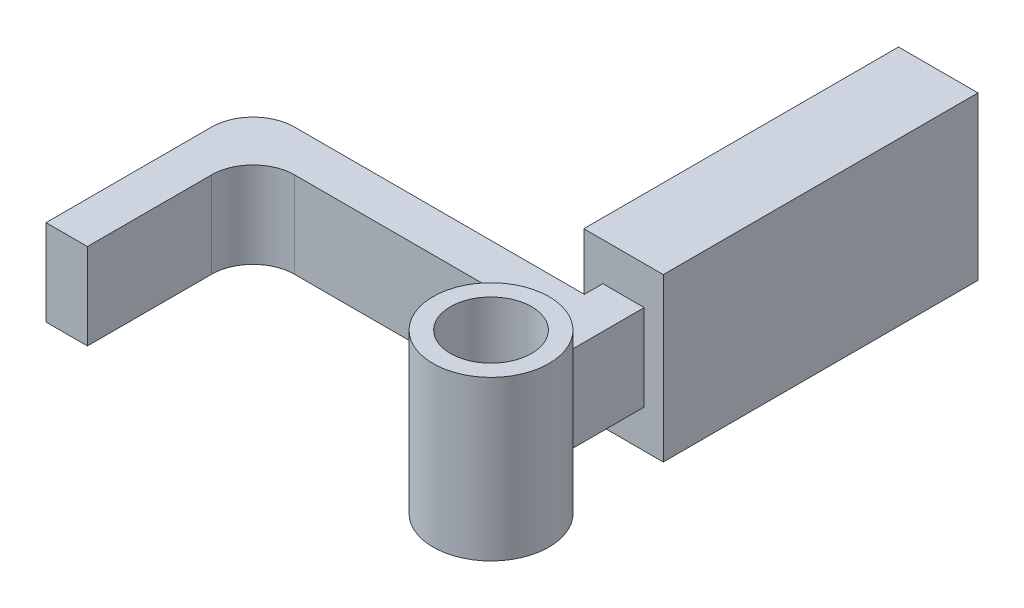
ISO-10303-21;
HEADER;
FILE_DESCRIPTION(('STEP AP214'),'2;1');
FILE_NAME('part.step','',(''),(''),'','','');
FILE_SCHEMA(('AUTOMOTIVE_DESIGN { 1 0 10303 214 1 1 1 1 }'));
ENDSEC;
DATA;
#1=APPLICATION_CONTEXT('core data for automotive mechanical design processes');
#2=APPLICATION_PROTOCOL_DEFINITION('international standard','automotive_design',2000,#1);
#3=PRODUCT_CONTEXT('',#1,'mechanical');
#4=PRODUCT('Part','Part','',(#3));
#5=PRODUCT_RELATED_PRODUCT_CATEGORY('part','',(#4));
#6=PRODUCT_DEFINITION_FORMATION('','',#4);
#7=PRODUCT_DEFINITION_CONTEXT('part definition',#1,'design');
#8=PRODUCT_DEFINITION('design','',#6,#7);
#9=PRODUCT_DEFINITION_SHAPE('','',#8);
#10=(LENGTH_UNIT() NAMED_UNIT(*) SI_UNIT(.MILLI.,.METRE.));
#11=(NAMED_UNIT(*) PLANE_ANGLE_UNIT() SI_UNIT($,.RADIAN.));
#12=(NAMED_UNIT(*) SI_UNIT($,.STERADIAN.) SOLID_ANGLE_UNIT());
#13=UNCERTAINTY_MEASURE_WITH_UNIT(LENGTH_MEASURE(1.E-05),#10,'distance_accuracy_value','');
#14=(GEOMETRIC_REPRESENTATION_CONTEXT(3) GLOBAL_UNCERTAINTY_ASSIGNED_CONTEXT((#13)) GLOBAL_UNIT_ASSIGNED_CONTEXT((#10,
#11,#12)) REPRESENTATION_CONTEXT('',''));
#15=CARTESIAN_POINT('',(0.,0.,0.));
#16=DIRECTION('',(0.,0.,1.));
#17=DIRECTION('',(1.,0.,0.));
#18=AXIS2_PLACEMENT_3D('',#15,#16,#17);
#19=CARTESIAN_POINT('',(-1.71915948008689,4.68,-2.26525934537268));
#20=DIRECTION('',(1.,0.,0.));
#21=DIRECTION('',(0.,0.,-1.));
#22=AXIS2_PLACEMENT_3D('',#19,#20,#21);
#23=PLANE('',#22);
#24=DIRECTION('',(0.,-1.,0.));
#25=VECTOR('',#24,1.);
#26=CARTESIAN_POINT('',(-1.71915948008689,23.5479622641132,-7.77292902843488));
#27=LINE('',#26,#25);
#28=CARTESIAN_POINT('',(-1.71915948008689,4.68,-7.77292902843488));
#29=VERTEX_POINT('',#28);
#30=CARTESIAN_POINT('',(-1.71915948008689,0.52,-7.77292902843488));
#31=VERTEX_POINT('',#30);
#32=EDGE_CURVE('E221',#29,#31,#27,.T.);
#33=ORIENTED_EDGE('',*,*,#32,.F.);
#34=DIRECTION('',(0.,0.,1.));
#35=VECTOR('',#34,1.);
#36=CARTESIAN_POINT('',(-1.71915948008689,4.68,-2.26525934537268));
#37=LINE('',#36,#35);
#38=CARTESIAN_POINT('',(-1.71915948008689,4.68,-8.66525934537268));
#39=VERTEX_POINT('',#38);
#40=EDGE_CURVE('E312',#39,#29,#37,.T.);
#41=ORIENTED_EDGE('',*,*,#40,.F.);
#42=DIRECTION('',(0.,-1.,0.));
#43=VECTOR('',#42,1.);
#44=CARTESIAN_POINT('',(-1.71915948008689,4.68,-8.66525934537268));
#45=LINE('',#44,#43);
#46=CARTESIAN_POINT('',(-1.71915948008689,0.52,-8.66525934537268));
#47=VERTEX_POINT('',#46);
#48=EDGE_CURVE('E12',#39,#47,#45,.T.);
#49=ORIENTED_EDGE('',*,*,#48,.T.);
#50=DIRECTION('',(0.,0.,1.));
#51=VECTOR('',#50,1.);
#52=CARTESIAN_POINT('',(-1.71915948008689,0.52,-2.26525934537268));
#53=LINE('',#52,#51);
#54=EDGE_CURVE('E310',#47,#31,#53,.T.);
#55=ORIENTED_EDGE('',*,*,#54,.T.);
#56=EDGE_LOOP('',(#33,#41,#49,#55));
#57=FACE_BOUND('',#56,.T.);
#58=ADVANCED_FACE('F48',(#57),#23,.F.);
#59=CARTESIAN_POINT('',(-0.71915948008689,4.68,-2.26525934537268));
#60=DIRECTION('',(0.,-1.,0.));
#61=DIRECTION('',(0.,0.,-1.));
#62=AXIS2_PLACEMENT_3D('',#59,#60,#61);
#63=CYLINDRICAL_SURFACE('',#62,2.8);
#64=DIRECTION('',(0.,-1.,0.));
#65=VECTOR('',#64,1.);
#66=CARTESIAN_POINT('',(-1.71915948008689,4.68,-4.88059871149708));
#67=LINE('',#66,#65);
#68=CARTESIAN_POINT('',(-1.71915948008689,4.68,-4.88059871149708));
#69=VERTEX_POINT('',#68);
#70=CARTESIAN_POINT('',(-1.71915948008689,0.52,-4.88059871149708));
#71=VERTEX_POINT('',#70);
#72=EDGE_CURVE('E58',#69,#71,#67,.T.);
#73=ORIENTED_EDGE('',*,*,#72,.T.);
#74=CARTESIAN_POINT('',(-0.71915948008689,0.52,-2.26525934537268));
#75=DIRECTION('',(0.,1.,0.));
#76=DIRECTION('',(0.,0.,1.));
#77=AXIS2_PLACEMENT_3D('',#74,#75,#76);
#78=CIRCLE('',#77,2.8);
#79=CARTESIAN_POINT('',(0.28084051991311,0.52,-4.88059871149708));
#80=VERTEX_POINT('',#79);
#81=EDGE_CURVE('E182',#80,#71,#78,.T.);
#82=ORIENTED_EDGE('',*,*,#81,.F.);
#83=DIRECTION('',(0.,-1.,0.));
#84=VECTOR('',#83,1.);
#85=CARTESIAN_POINT('',(0.28084051991311,4.68,-4.88059871149708));
#86=LINE('',#85,#84);
#87=CARTESIAN_POINT('',(0.28084051991311,4.68,-4.88059871149708));
#88=VERTEX_POINT('',#87);
#89=EDGE_CURVE('E169',#88,#80,#86,.T.);
#90=ORIENTED_EDGE('',*,*,#89,.F.);
#91=CARTESIAN_POINT('',(-0.71915948008689,4.68,-2.26525934537268));
#92=DIRECTION('',(0.,1.,0.));
#93=DIRECTION('',(0.,0.,1.));
#94=AXIS2_PLACEMENT_3D('',#91,#92,#93);
#95=CIRCLE('',#94,2.8);
#96=EDGE_CURVE('E181',#88,#69,#95,.T.);
#97=ORIENTED_EDGE('',*,*,#96,.T.);
#98=EDGE_LOOP('',(#73,#82,#90,#97));
#99=FACE_BOUND('',#98,.T.);
#100=CARTESIAN_POINT('',(-0.71915948008689,-1.24,-2.26525934537268));
#101=DIRECTION('',(0.,-1.,0.));
#102=DIRECTION('',(0.,0.,-1.));
#103=AXIS2_PLACEMENT_3D('',#100,#101,#102);
#104=CIRCLE('',#103,2.8);
#105=CARTESIAN_POINT('',(-0.71915948008689,-1.24,-5.06525934537268));
#106=VERTEX_POINT('',#105);
#107=EDGE_CURVE('E416',#106,#106,#104,.T.);
#108=ORIENTED_EDGE('',*,*,#107,.F.);
#109=EDGE_LOOP('',(#108));
#110=FACE_BOUND('',#109,.T.);
#111=CARTESIAN_POINT('',(-0.71915948008689,6.44,-2.26525934537268));
#112=DIRECTION('',(0.,-1.,0.));
#113=DIRECTION('',(0.,0.,-1.));
#114=AXIS2_PLACEMENT_3D('',#111,#112,#113);
#115=CIRCLE('',#114,2.8);
#116=CARTESIAN_POINT('',(-0.71915948008689,6.44,-5.06525934537268));
#117=VERTEX_POINT('',#116);
#118=EDGE_CURVE('E192',#117,#117,#115,.T.);
#119=ORIENTED_EDGE('',*,*,#118,.T.);
#120=EDGE_LOOP('',(#119));
#121=FACE_BOUND('',#120,.T.);
#122=ADVANCED_FACE('F50',(#99,#110,#121),#63,.T.);
#123=CARTESIAN_POINT('',(-0.71915948008689,4.68,-2.26525934537268));
#124=DIRECTION('',(0.,1.,0.));
#125=DIRECTION('',(0.,0.,1.));
#126=AXIS2_PLACEMENT_3D('',#123,#124,#125);
#127=PLANE('',#126);
#128=ORIENTED_EDGE('',*,*,#96,.F.);
#129=DIRECTION('',(0.,0.,1.));
#130=VECTOR('',#129,1.);
#131=CARTESIAN_POINT('',(0.28084051991311,4.68,-2.26525934537268));
#132=LINE('',#131,#130);
#133=CARTESIAN_POINT('',(0.28084051991311,4.68,-8.66525934537268));
#134=VERTEX_POINT('',#133);
#135=EDGE_CURVE('E165',#134,#88,#132,.T.);
#136=ORIENTED_EDGE('',*,*,#135,.F.);
#137=DIRECTION('',(1.,0.,0.));
#138=VECTOR('',#137,1.);
#139=CARTESIAN_POINT('',(-0.71915948008689,4.68,-8.66525934537268));
#140=LINE('',#139,#138);
#141=EDGE_CURVE('E175',#39,#134,#140,.T.);
#142=ORIENTED_EDGE('',*,*,#141,.F.);
#143=ORIENTED_EDGE('',*,*,#40,.T.);
#144=DIRECTION('',(-1.,0.,0.));
#145=VECTOR('',#144,1.);
#146=CARTESIAN_POINT('',(-0.719159480086889,4.68,-7.77292902843488));
#147=LINE('',#146,#145);
#148=CARTESIAN_POINT('',(-15.7191594800869,4.68000000000001,-7.77292902843488));
#149=VERTEX_POINT('',#148);
#150=EDGE_CURVE('E225',#29,#149,#147,.T.);
#151=ORIENTED_EDGE('',*,*,#150,.T.);
#152=CARTESIAN_POINT('',(-15.7191594800869,4.68,-5.77292902843488));
#153=DIRECTION('',(0.,1.,0.));
#154=DIRECTION('',(0.,0.,1.));
#155=AXIS2_PLACEMENT_3D('',#152,#153,#154);
#156=CIRCLE('',#155,2.);
#157=CARTESIAN_POINT('',(-17.7191594800869,4.68,-5.77292902843488));
#158=VERTEX_POINT('',#157);
#159=EDGE_CURVE('E206',#158,#149,#156,.F.);
#160=ORIENTED_EDGE('',*,*,#159,.F.);
#161=DIRECTION('',(0.,0.,1.));
#162=VECTOR('',#161,1.);
#163=CARTESIAN_POINT('',(-17.7191594800869,4.68,-2.26525934537268));
#164=LINE('',#163,#162);
#165=CARTESIAN_POINT('',(-17.7191594800869,4.68,2.22707097156512));
#166=VERTEX_POINT('',#165);
#167=EDGE_CURVE('E186',#158,#166,#164,.T.);
#168=ORIENTED_EDGE('',*,*,#167,.T.);
#169=DIRECTION('',(1.,0.,0.));
#170=VECTOR('',#169,1.);
#171=CARTESIAN_POINT('',(-0.71915948008689,4.68,2.22707097156512));
#172=LINE('',#171,#170);
#173=CARTESIAN_POINT('',(-15.7191594800869,4.68,2.22707097156512));
#174=VERTEX_POINT('',#173);
#175=EDGE_CURVE('E190',#166,#174,#172,.T.);
#176=ORIENTED_EDGE('',*,*,#175,.T.);
#177=DIRECTION('',(0.,0.,1.));
#178=VECTOR('',#177,1.);
#179=CARTESIAN_POINT('',(-15.7191594800869,4.68,-2.26525934537268));
#180=LINE('',#179,#178);
#181=CARTESIAN_POINT('',(-15.7191594800869,4.68,-3.77292902843488));
#182=VERTEX_POINT('',#181);
#183=EDGE_CURVE('E211',#182,#174,#180,.T.);
#184=ORIENTED_EDGE('',*,*,#183,.F.);
#185=CARTESIAN_POINT('',(-13.7191594800869,4.68,-3.77292902843488));
#186=DIRECTION('',(0.,1.,0.));
#187=DIRECTION('',(0.,0.,1.));
#188=AXIS2_PLACEMENT_3D('',#185,#186,#187);
#189=CIRCLE('',#188,2.);
#190=CARTESIAN_POINT('',(-13.7191594800869,4.68,-5.77292902843488));
#191=VERTEX_POINT('',#190);
#192=EDGE_CURVE('E237',#182,#191,#189,.F.);
#193=ORIENTED_EDGE('',*,*,#192,.T.);
#194=DIRECTION('',(-1.,0.,0.));
#195=VECTOR('',#194,1.);
#196=CARTESIAN_POINT('',(-0.719159480086889,4.68,-5.77292902843488));
#197=LINE('',#196,#195);
#198=CARTESIAN_POINT('',(-1.71915948008689,4.68,-5.77292902843488));
#199=VERTEX_POINT('',#198);
#200=EDGE_CURVE('E244',#199,#191,#197,.T.);
#201=ORIENTED_EDGE('',*,*,#200,.F.);
#202=EDGE_CURVE('E74',#199,#69,#37,.T.);
#203=ORIENTED_EDGE('',*,*,#202,.T.);
#204=EDGE_LOOP('',(#128,#136,#142,#143,#151,#160,#168,#176,#184,#193,#201,#203));
#205=FACE_BOUND('',#204,.T.);
#206=ADVANCED_FACE('F184',(#205),#127,.T.);
#207=CARTESIAN_POINT('',(-0.71915948008689,0.52,-2.26525934537268));
#208=DIRECTION('',(0.,1.,0.));
#209=DIRECTION('',(0.,0.,1.));
#210=AXIS2_PLACEMENT_3D('',#207,#208,#209);
#211=PLANE('',#210);
#212=DIRECTION('',(0.,0.,1.));
#213=VECTOR('',#212,1.);
#214=CARTESIAN_POINT('',(0.28084051991311,0.52,-2.26525934537268));
#215=LINE('',#214,#213);
#216=CARTESIAN_POINT('',(0.28084051991311,0.52,-8.66525934537268));
#217=VERTEX_POINT('',#216);
#218=EDGE_CURVE('E318',#217,#80,#215,.T.);
#219=ORIENTED_EDGE('',*,*,#218,.T.);
#220=ORIENTED_EDGE('',*,*,#81,.T.);
#221=CARTESIAN_POINT('',(-1.71915948008689,0.52,-5.77292902843488));
#222=VERTEX_POINT('',#221);
#223=EDGE_CURVE('E321',#222,#71,#53,.T.);
#224=ORIENTED_EDGE('',*,*,#223,.F.);
#225=DIRECTION('',(-1.,0.,0.));
#226=VECTOR('',#225,1.);
#227=CARTESIAN_POINT('',(-0.719159480086889,0.52,-5.77292902843488));
#228=LINE('',#227,#226);
#229=CARTESIAN_POINT('',(-13.7191594800869,0.52,-5.77292902843488));
#230=VERTEX_POINT('',#229);
#231=EDGE_CURVE('E66',#222,#230,#228,.T.);
#232=ORIENTED_EDGE('',*,*,#231,.T.);
#233=CARTESIAN_POINT('',(-13.7191594800869,0.52,-3.77292902843488));
#234=DIRECTION('',(0.,-1.,0.));
#235=DIRECTION('',(0.,0.,-1.));
#236=AXIS2_PLACEMENT_3D('',#233,#234,#235);
#237=CIRCLE('',#236,2.);
#238=CARTESIAN_POINT('',(-15.7191594800869,0.52,-3.77292902843488));
#239=VERTEX_POINT('',#238);
#240=EDGE_CURVE('E207',#239,#230,#237,.T.);
#241=ORIENTED_EDGE('',*,*,#240,.F.);
#242=DIRECTION('',(0.,0.,1.));
#243=VECTOR('',#242,1.);
#244=CARTESIAN_POINT('',(-15.7191594800869,0.52,-2.26525934537268));
#245=LINE('',#244,#243);
#246=CARTESIAN_POINT('',(-15.7191594800869,0.52,2.22707097156512));
#247=VERTEX_POINT('',#246);
#248=EDGE_CURVE('E202',#239,#247,#245,.T.);
#249=ORIENTED_EDGE('',*,*,#248,.T.);
#250=DIRECTION('',(1.,0.,0.));
#251=VECTOR('',#250,1.);
#252=CARTESIAN_POINT('',(-0.71915948008689,0.52,2.22707097156512));
#253=LINE('',#252,#251);
#254=CARTESIAN_POINT('',(-17.7191594800869,0.52,2.22707097156512));
#255=VERTEX_POINT('',#254);
#256=EDGE_CURVE('E196',#255,#247,#253,.T.);
#257=ORIENTED_EDGE('',*,*,#256,.F.);
#258=DIRECTION('',(0.,0.,1.));
#259=VECTOR('',#258,1.);
#260=CARTESIAN_POINT('',(-17.7191594800869,0.52,-2.26525934537268));
#261=LINE('',#260,#259);
#262=CARTESIAN_POINT('',(-17.7191594800869,0.52,-5.77292902843488));
#263=VERTEX_POINT('',#262);
#264=EDGE_CURVE('E226',#263,#255,#261,.T.);
#265=ORIENTED_EDGE('',*,*,#264,.F.);
#266=CARTESIAN_POINT('',(-15.7191594800869,0.52,-5.77292902843488));
#267=DIRECTION('',(0.,-1.,0.));
#268=DIRECTION('',(0.,0.,-1.));
#269=AXIS2_PLACEMENT_3D('',#266,#267,#268);
#270=CIRCLE('',#269,2.);
#271=CARTESIAN_POINT('',(-15.7191594800869,0.52,-7.77292902843488));
#272=VERTEX_POINT('',#271);
#273=EDGE_CURVE('E215',#263,#272,#270,.T.);
#274=ORIENTED_EDGE('',*,*,#273,.T.);
#275=DIRECTION('',(-1.,0.,0.));
#276=VECTOR('',#275,1.);
#277=CARTESIAN_POINT('',(-0.719159480086889,0.52,-7.77292902843488));
#278=LINE('',#277,#276);
#279=EDGE_CURVE('E216',#31,#272,#278,.T.);
#280=ORIENTED_EDGE('',*,*,#279,.F.);
#281=ORIENTED_EDGE('',*,*,#54,.F.);
#282=DIRECTION('',(1.,0.,0.));
#283=VECTOR('',#282,1.);
#284=CARTESIAN_POINT('',(-0.71915948008689,0.52,-8.66525934537268));
#285=LINE('',#284,#283);
#286=EDGE_CURVE('E308',#47,#217,#285,.T.);
#287=ORIENTED_EDGE('',*,*,#286,.T.);
#288=EDGE_LOOP('',(#219,#220,#224,#232,#241,#249,#257,#265,#274,#280,#281,#287));
#289=FACE_BOUND('',#288,.T.);
#290=ADVANCED_FACE('F345',(#289),#211,.F.);
#291=ORIENTED_EDGE('',*,*,#202,.F.);
#292=DIRECTION('',(0.,-1.,0.));
#293=VECTOR('',#292,1.);
#294=CARTESIAN_POINT('',(-1.71915948008689,23.5479622641132,-5.77292902843488));
#295=LINE('',#294,#293);
#296=EDGE_CURVE('E220',#199,#222,#295,.T.);
#297=ORIENTED_EDGE('',*,*,#296,.T.);
#298=ORIENTED_EDGE('',*,*,#223,.T.);
#299=ORIENTED_EDGE('',*,*,#72,.F.);
#300=EDGE_LOOP('',(#291,#297,#298,#299));
#301=FACE_BOUND('',#300,.T.);
#302=ADVANCED_FACE('F328',(#301),#23,.F.);
#303=CARTESIAN_POINT('',(0.28084051991311,4.68,-2.26525934537268));
#304=DIRECTION('',(1.,0.,0.));
#305=DIRECTION('',(0.,0.,-1.));
#306=AXIS2_PLACEMENT_3D('',#303,#304,#305);
#307=PLANE('',#306);
#308=ORIENTED_EDGE('',*,*,#218,.F.);
#309=DIRECTION('',(0.,-1.,0.));
#310=VECTOR('',#309,1.);
#311=CARTESIAN_POINT('',(0.28084051991311,4.68,-8.66525934537268));
#312=LINE('',#311,#310);
#313=EDGE_CURVE('E52',#134,#217,#312,.T.);
#314=ORIENTED_EDGE('',*,*,#313,.F.);
#315=ORIENTED_EDGE('',*,*,#135,.T.);
#316=ORIENTED_EDGE('',*,*,#89,.T.);
#317=EDGE_LOOP('',(#308,#314,#315,#316));
#318=FACE_BOUND('',#317,.T.);
#319=ADVANCED_FACE('F168',(#318),#307,.T.);
#320=CARTESIAN_POINT('',(-0.71915948008689,0.52,-8.66525934537268));
#321=DIRECTION('',(0.,0.,1.));
#322=DIRECTION('',(1.,0.,0.));
#323=AXIS2_PLACEMENT_3D('',#320,#321,#322);
#324=PLANE('',#323);
#325=DIRECTION('',(0.,1.,0.));
#326=VECTOR('',#325,1.);
#327=CARTESIAN_POINT('',(-2.63915948008689,-1.32,-8.66525934537268));
#328=LINE('',#327,#326);
#329=CARTESIAN_POINT('',(-2.63915948008689,-1.32,-8.66525934537268));
#330=VERTEX_POINT('',#329);
#331=CARTESIAN_POINT('',(-2.63915948008689,6.52,-8.66525934537268));
#332=VERTEX_POINT('',#331);
#333=EDGE_CURVE('E230',#330,#332,#328,.T.);
#334=ORIENTED_EDGE('',*,*,#333,.F.);
#335=DIRECTION('',(-1.,0.,0.));
#336=VECTOR('',#335,1.);
#337=CARTESIAN_POINT('',(1.20084051991311,-1.32,-8.66525934537268));
#338=LINE('',#337,#336);
#339=CARTESIAN_POINT('',(1.20084051991311,-1.32,-8.66525934537268));
#340=VERTEX_POINT('',#339);
#341=EDGE_CURVE('E272',#340,#330,#338,.T.);
#342=ORIENTED_EDGE('',*,*,#341,.F.);
#343=DIRECTION('',(0.,-1.,0.));
#344=VECTOR('',#343,1.);
#345=CARTESIAN_POINT('',(1.20084051991311,-1.32,-8.66525934537268));
#346=LINE('',#345,#344);
#347=CARTESIAN_POINT('',(1.20084051991311,6.52,-8.66525934537268));
#348=VERTEX_POINT('',#347);
#349=EDGE_CURVE('E288',#348,#340,#346,.T.);
#350=ORIENTED_EDGE('',*,*,#349,.F.);
#351=DIRECTION('',(1.,0.,0.));
#352=VECTOR('',#351,1.);
#353=CARTESIAN_POINT('',(1.20084051991311,6.52,-8.66525934537268));
#354=LINE('',#353,#352);
#355=EDGE_CURVE('E285',#332,#348,#354,.T.);
#356=ORIENTED_EDGE('',*,*,#355,.F.);
#357=EDGE_LOOP('',(#334,#342,#350,#356));
#358=FACE_BOUND('',#357,.T.);
#359=ORIENTED_EDGE('',*,*,#286,.F.);
#360=ORIENTED_EDGE('',*,*,#48,.F.);
#361=ORIENTED_EDGE('',*,*,#141,.T.);
#362=ORIENTED_EDGE('',*,*,#313,.T.);
#363=EDGE_LOOP('',(#359,#360,#361,#362));
#364=FACE_BOUND('',#363,.T.);
#365=ADVANCED_FACE('F336',(#358,#364),#324,.T.);
#366=CARTESIAN_POINT('',(-2.63915948008689,-1.32,-23.8652593453727));
#367=DIRECTION('',(1.,0.,0.));
#368=DIRECTION('',(0.,0.,-1.));
#369=AXIS2_PLACEMENT_3D('',#366,#367,#368);
#370=PLANE('',#369);
#371=ORIENTED_EDGE('',*,*,#333,.T.);
#372=DIRECTION('',(0.,0.,1.));
#373=VECTOR('',#372,1.);
#374=CARTESIAN_POINT('',(-2.63915948008689,6.52,-23.8652593453727));
#375=LINE('',#374,#373);
#376=CARTESIAN_POINT('',(-2.63915948008689,6.52,-23.8652593453727));
#377=VERTEX_POINT('',#376);
#378=EDGE_CURVE('E304',#377,#332,#375,.T.);
#379=ORIENTED_EDGE('',*,*,#378,.F.);
#380=DIRECTION('',(0.,1.,0.));
#381=VECTOR('',#380,1.);
#382=CARTESIAN_POINT('',(-2.63915948008689,-1.32,-23.8652593453727));
#383=LINE('',#382,#381);
#384=CARTESIAN_POINT('',(-2.63915948008689,-1.32,-23.8652593453727));
#385=VERTEX_POINT('',#384);
#386=EDGE_CURVE('E267',#385,#377,#383,.T.);
#387=ORIENTED_EDGE('',*,*,#386,.F.);
#388=DIRECTION('',(0.,0.,1.));
#389=VECTOR('',#388,1.);
#390=CARTESIAN_POINT('',(-2.63915948008689,-1.32,-23.8652593453727));
#391=LINE('',#390,#389);
#392=EDGE_CURVE('E281',#385,#330,#391,.T.);
#393=ORIENTED_EDGE('',*,*,#392,.T.);
#394=EDGE_LOOP('',(#371,#379,#387,#393));
#395=FACE_BOUND('',#394,.T.);
#396=ADVANCED_FACE('F590',(#395),#370,.F.);
#397=CARTESIAN_POINT('',(1.20084051991311,6.52,-23.8652593453727));
#398=DIRECTION('',(0.,-1.,0.));
#399=DIRECTION('',(0.,0.,-1.));
#400=AXIS2_PLACEMENT_3D('',#397,#398,#399);
#401=PLANE('',#400);
#402=ORIENTED_EDGE('',*,*,#355,.T.);
#403=DIRECTION('',(0.,0.,1.));
#404=VECTOR('',#403,1.);
#405=CARTESIAN_POINT('',(1.20084051991311,6.52,-23.8652593453727));
#406=LINE('',#405,#404);
#407=CARTESIAN_POINT('',(1.20084051991311,6.52,-23.8652593453727));
#408=VERTEX_POINT('',#407);
#409=EDGE_CURVE('E300',#408,#348,#406,.T.);
#410=ORIENTED_EDGE('',*,*,#409,.F.);
#411=DIRECTION('',(1.,0.,0.));
#412=VECTOR('',#411,1.);
#413=CARTESIAN_POINT('',(1.20084051991311,6.52,-23.8652593453727));
#414=LINE('',#413,#412);
#415=EDGE_CURVE('E271',#377,#408,#414,.T.);
#416=ORIENTED_EDGE('',*,*,#415,.F.);
#417=ORIENTED_EDGE('',*,*,#378,.T.);
#418=EDGE_LOOP('',(#402,#410,#416,#417));
#419=FACE_BOUND('',#418,.T.);
#420=ADVANCED_FACE('F581',(#419),#401,.F.);
#421=CARTESIAN_POINT('',(1.20084051991311,-1.32,-23.8652593453727));
#422=DIRECTION('',(-1.,0.,0.));
#423=DIRECTION('',(0.,0.,1.));
#424=AXIS2_PLACEMENT_3D('',#421,#422,#423);
#425=PLANE('',#424);
#426=ORIENTED_EDGE('',*,*,#349,.T.);
#427=DIRECTION('',(0.,0.,1.));
#428=VECTOR('',#427,1.);
#429=CARTESIAN_POINT('',(1.20084051991311,-1.32,-23.8652593453727));
#430=LINE('',#429,#428);
#431=CARTESIAN_POINT('',(1.20084051991311,-1.32,-23.8652593453727));
#432=VERTEX_POINT('',#431);
#433=EDGE_CURVE('E296',#432,#340,#430,.T.);
#434=ORIENTED_EDGE('',*,*,#433,.F.);
#435=DIRECTION('',(0.,-1.,0.));
#436=VECTOR('',#435,1.);
#437=CARTESIAN_POINT('',(1.20084051991311,-1.32,-23.8652593453727));
#438=LINE('',#437,#436);
#439=EDGE_CURVE('E275',#408,#432,#438,.T.);
#440=ORIENTED_EDGE('',*,*,#439,.F.);
#441=ORIENTED_EDGE('',*,*,#409,.T.);
#442=EDGE_LOOP('',(#426,#434,#440,#441));
#443=FACE_BOUND('',#442,.T.);
#444=ADVANCED_FACE('F572',(#443),#425,.F.);
#445=CARTESIAN_POINT('',(1.20084051991311,-1.32,-23.8652593453727));
#446=DIRECTION('',(0.,1.,0.));
#447=DIRECTION('',(0.,0.,1.));
#448=AXIS2_PLACEMENT_3D('',#445,#446,#447);
#449=PLANE('',#448);
#450=ORIENTED_EDGE('',*,*,#341,.T.);
#451=ORIENTED_EDGE('',*,*,#392,.F.);
#452=DIRECTION('',(-1.,0.,0.));
#453=VECTOR('',#452,1.);
#454=CARTESIAN_POINT('',(1.20084051991311,-1.32,-23.8652593453727));
#455=LINE('',#454,#453);
#456=EDGE_CURVE('E278',#432,#385,#455,.T.);
#457=ORIENTED_EDGE('',*,*,#456,.F.);
#458=ORIENTED_EDGE('',*,*,#433,.T.);
#459=EDGE_LOOP('',(#450,#451,#457,#458));
#460=FACE_BOUND('',#459,.T.);
#461=ADVANCED_FACE('F563',(#460),#449,.F.);
#462=CARTESIAN_POINT('',(-0.71915948008689,0.52,-23.8652593453727));
#463=DIRECTION('',(0.,0.,1.));
#464=DIRECTION('',(1.,0.,0.));
#465=AXIS2_PLACEMENT_3D('',#462,#463,#464);
#466=PLANE('',#465);
#467=ORIENTED_EDGE('',*,*,#386,.T.);
#468=ORIENTED_EDGE('',*,*,#415,.T.);
#469=ORIENTED_EDGE('',*,*,#439,.T.);
#470=ORIENTED_EDGE('',*,*,#456,.T.);
#471=EDGE_LOOP('',(#467,#468,#469,#470));
#472=FACE_BOUND('',#471,.T.);
#473=ADVANCED_FACE('F539',(#472),#466,.F.);
#474=CARTESIAN_POINT('',(-15.7191594800869,23.5479622641132,-5.77292902843488));
#475=DIRECTION('',(0.,-1.,0.));
#476=DIRECTION('',(0.,0.,-1.));
#477=AXIS2_PLACEMENT_3D('',#474,#475,#476);
#478=CYLINDRICAL_SURFACE('',#477,2.);
#479=DIRECTION('',(0.,-1.,0.));
#480=VECTOR('',#479,1.);
#481=CARTESIAN_POINT('',(-17.7191594800869,23.5479622641132,-5.77292902843488));
#482=LINE('',#481,#480);
#483=EDGE_CURVE('E200',#158,#263,#482,.T.);
#484=ORIENTED_EDGE('',*,*,#483,.F.);
#485=ORIENTED_EDGE('',*,*,#159,.T.);
#486=DIRECTION('',(0.,-1.,0.));
#487=VECTOR('',#486,1.);
#488=CARTESIAN_POINT('',(-15.7191594800869,23.5479622641132,-7.77292902843488));
#489=LINE('',#488,#487);
#490=EDGE_CURVE('E233',#149,#272,#489,.T.);
#491=ORIENTED_EDGE('',*,*,#490,.T.);
#492=ORIENTED_EDGE('',*,*,#273,.F.);
#493=EDGE_LOOP('',(#484,#485,#491,#492));
#494=FACE_BOUND('',#493,.T.);
#495=ADVANCED_FACE('F351',(#494),#478,.T.);
#496=CARTESIAN_POINT('',(-0.719159480086889,23.5479622641132,-7.77292902843488));
#497=DIRECTION('',(0.,0.,1.));
#498=DIRECTION('',(1.,0.,0.));
#499=AXIS2_PLACEMENT_3D('',#496,#497,#498);
#500=PLANE('',#499);
#501=ORIENTED_EDGE('',*,*,#150,.F.);
#502=ORIENTED_EDGE('',*,*,#32,.T.);
#503=ORIENTED_EDGE('',*,*,#279,.T.);
#504=ORIENTED_EDGE('',*,*,#490,.F.);
#505=EDGE_LOOP('',(#501,#502,#503,#504));
#506=FACE_BOUND('',#505,.T.);
#507=ADVANCED_FACE('F344',(#506),#500,.F.);
#508=CARTESIAN_POINT('',(-0.719159480086889,23.5479622641132,-5.77292902843488));
#509=DIRECTION('',(0.,0.,1.));
#510=DIRECTION('',(1.,0.,0.));
#511=AXIS2_PLACEMENT_3D('',#508,#509,#510);
#512=PLANE('',#511);
#513=ORIENTED_EDGE('',*,*,#296,.F.);
#514=ORIENTED_EDGE('',*,*,#200,.T.);
#515=DIRECTION('',(0.,-1.,0.));
#516=VECTOR('',#515,1.);
#517=CARTESIAN_POINT('',(-13.7191594800869,23.5479622641132,-5.77292902843488));
#518=LINE('',#517,#516);
#519=EDGE_CURVE('E248',#191,#230,#518,.T.);
#520=ORIENTED_EDGE('',*,*,#519,.T.);
#521=ORIENTED_EDGE('',*,*,#231,.F.);
#522=EDGE_LOOP('',(#513,#514,#520,#521));
#523=FACE_BOUND('',#522,.T.);
#524=ADVANCED_FACE('F369',(#523),#512,.T.);
#525=CARTESIAN_POINT('',(-13.7191594800869,23.5479622641132,-3.77292902843488));
#526=DIRECTION('',(0.,-1.,0.));
#527=DIRECTION('',(0.,0.,-1.));
#528=AXIS2_PLACEMENT_3D('',#525,#526,#527);
#529=CYLINDRICAL_SURFACE('',#528,2.);
#530=ORIENTED_EDGE('',*,*,#192,.F.);
#531=DIRECTION('',(0.,-1.,0.));
#532=VECTOR('',#531,1.);
#533=CARTESIAN_POINT('',(-15.7191594800869,23.5479622641132,-3.77292902843488));
#534=LINE('',#533,#532);
#535=EDGE_CURVE('E212',#182,#239,#534,.T.);
#536=ORIENTED_EDGE('',*,*,#535,.T.);
#537=ORIENTED_EDGE('',*,*,#240,.T.);
#538=ORIENTED_EDGE('',*,*,#519,.F.);
#539=EDGE_LOOP('',(#530,#536,#537,#538));
#540=FACE_BOUND('',#539,.T.);
#541=ADVANCED_FACE('F368',(#540),#529,.F.);
#542=CARTESIAN_POINT('',(-15.7191594800869,23.5479622641132,-2.26525934537268));
#543=DIRECTION('',(1.,0.,0.));
#544=DIRECTION('',(0.,0.,-1.));
#545=AXIS2_PLACEMENT_3D('',#542,#543,#544);
#546=PLANE('',#545);
#547=ORIENTED_EDGE('',*,*,#535,.F.);
#548=ORIENTED_EDGE('',*,*,#183,.T.);
#549=DIRECTION('',(0.,-1.,0.));
#550=VECTOR('',#549,1.);
#551=CARTESIAN_POINT('',(-15.7191594800869,23.5479622641132,2.22707097156512));
#552=LINE('',#551,#550);
#553=EDGE_CURVE('E241',#174,#247,#552,.T.);
#554=ORIENTED_EDGE('',*,*,#553,.T.);
#555=ORIENTED_EDGE('',*,*,#248,.F.);
#556=EDGE_LOOP('',(#547,#548,#554,#555));
#557=FACE_BOUND('',#556,.T.);
#558=ADVANCED_FACE('F365',(#557),#546,.T.);
#559=CARTESIAN_POINT('',(-0.71915948008689,23.5479622641132,2.22707097156512));
#560=DIRECTION('',(0.,0.,-1.));
#561=DIRECTION('',(-1.,0.,0.));
#562=AXIS2_PLACEMENT_3D('',#559,#560,#561);
#563=PLANE('',#562);
#564=ORIENTED_EDGE('',*,*,#175,.F.);
#565=DIRECTION('',(0.,-1.,0.));
#566=VECTOR('',#565,1.);
#567=CARTESIAN_POINT('',(-17.7191594800869,23.5479622641132,2.22707097156512));
#568=LINE('',#567,#566);
#569=EDGE_CURVE('E201',#166,#255,#568,.T.);
#570=ORIENTED_EDGE('',*,*,#569,.T.);
#571=ORIENTED_EDGE('',*,*,#256,.T.);
#572=ORIENTED_EDGE('',*,*,#553,.F.);
#573=EDGE_LOOP('',(#564,#570,#571,#572));
#574=FACE_BOUND('',#573,.T.);
#575=ADVANCED_FACE('F359',(#574),#563,.F.);
#576=CARTESIAN_POINT('',(-17.7191594800869,23.5479622641132,-2.26525934537268));
#577=DIRECTION('',(1.,0.,0.));
#578=DIRECTION('',(0.,0.,-1.));
#579=AXIS2_PLACEMENT_3D('',#576,#577,#578);
#580=PLANE('',#579);
#581=ORIENTED_EDGE('',*,*,#167,.F.);
#582=ORIENTED_EDGE('',*,*,#483,.T.);
#583=ORIENTED_EDGE('',*,*,#264,.T.);
#584=ORIENTED_EDGE('',*,*,#569,.F.);
#585=EDGE_LOOP('',(#581,#582,#583,#584));
#586=FACE_BOUND('',#585,.T.);
#587=ADVANCED_FACE('F355',(#586),#580,.F.);
#588=CARTESIAN_POINT('',(-0.71915948008689,-1.24,-2.26525934537268));
#589=DIRECTION('',(0.,-1.,0.));
#590=DIRECTION('',(0.,0.,-1.));
#591=AXIS2_PLACEMENT_3D('',#588,#589,#590);
#592=PLANE('',#591);
#593=ORIENTED_EDGE('',*,*,#107,.T.);
#594=EDGE_LOOP('',(#593));
#595=FACE_BOUND('',#594,.T.);
#596=CARTESIAN_POINT('',(-0.71915948008689,-1.24,-2.26525934537268));
#597=DIRECTION('',(0.,-1.,0.));
#598=DIRECTION('',(0.,0.,-1.));
#599=AXIS2_PLACEMENT_3D('',#596,#597,#598);
#600=CIRCLE('',#599,1.96);
#601=CARTESIAN_POINT('',(-0.71915948008689,-1.24,-4.22525934537268));
#602=VERTEX_POINT('',#601);
#603=EDGE_CURVE('E411',#602,#602,#600,.T.);
#604=ORIENTED_EDGE('',*,*,#603,.F.);
#605=EDGE_LOOP('',(#604));
#606=FACE_BOUND('',#605,.T.);
#607=ADVANCED_FACE('F398',(#595,#606),#592,.T.);
#608=CARTESIAN_POINT('',(-0.71915948008689,4.68,-2.26525934537268));
#609=DIRECTION('',(0.,-1.,0.));
#610=DIRECTION('',(0.,0.,-1.));
#611=AXIS2_PLACEMENT_3D('',#608,#609,#610);
#612=CYLINDRICAL_SURFACE('',#611,1.96);
#613=ORIENTED_EDGE('',*,*,#603,.T.);
#614=EDGE_LOOP('',(#613));
#615=FACE_BOUND('',#614,.T.);
#616=CARTESIAN_POINT('',(-0.71915948008689,6.44,-2.26525934537268));
#617=DIRECTION('',(0.,-1.,0.));
#618=DIRECTION('',(0.,0.,-1.));
#619=AXIS2_PLACEMENT_3D('',#616,#617,#618);
#620=CIRCLE('',#619,1.96);
#621=CARTESIAN_POINT('',(-0.71915948008689,6.44,-4.22525934537268));
#622=VERTEX_POINT('',#621);
#623=EDGE_CURVE('E414',#622,#622,#620,.T.);
#624=ORIENTED_EDGE('',*,*,#623,.F.);
#625=EDGE_LOOP('',(#624));
#626=FACE_BOUND('',#625,.T.);
#627=ADVANCED_FACE('F395',(#615,#626),#612,.F.);
#628=CARTESIAN_POINT('',(-0.71915948008689,6.44,-2.26525934537268));
#629=DIRECTION('',(0.,-1.,0.));
#630=DIRECTION('',(0.,0.,-1.));
#631=AXIS2_PLACEMENT_3D('',#628,#629,#630);
#632=PLANE('',#631);
#633=ORIENTED_EDGE('',*,*,#623,.T.);
#634=EDGE_LOOP('',(#633));
#635=FACE_BOUND('',#634,.T.);
#636=ORIENTED_EDGE('',*,*,#118,.F.);
#637=EDGE_LOOP('',(#636));
#638=FACE_BOUND('',#637,.T.);
#639=ADVANCED_FACE('F397',(#635,#638),#632,.F.);
#640=CLOSED_SHELL('',(#58,#122,#206,#290,#302,#319,#365,#396,#420,#444,#461,#473,#495,#507,#524,
#541,#558,#575,#587,#607,#627,#639));
#641=MANIFOLD_SOLID_BREP('B2',#640);
#642=ADVANCED_BREP_SHAPE_REPRESENTATION('',(#18,#641),#14);
#643=SHAPE_DEFINITION_REPRESENTATION(#9,#642);
ENDSEC;
END-ISO-10303-21;
